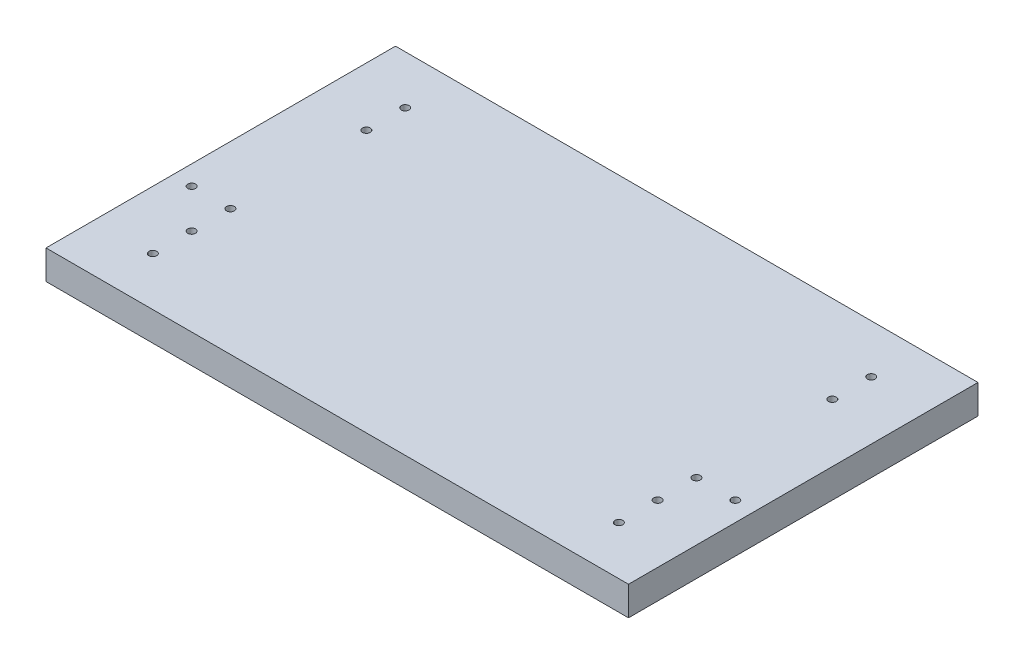
ISO-10303-21;
HEADER;
FILE_DESCRIPTION(('STEP AP214'),'2;1');
FILE_NAME('part.step','',(''),(''),'','','');
FILE_SCHEMA(('AUTOMOTIVE_DESIGN { 1 0 10303 214 1 1 1 1 }'));
ENDSEC;
DATA;
#1=APPLICATION_CONTEXT('core data for automotive mechanical design processes');
#2=APPLICATION_PROTOCOL_DEFINITION('international standard','automotive_design',2000,#1);
#3=PRODUCT_CONTEXT('',#1,'mechanical');
#4=PRODUCT('Part','Part','',(#3));
#5=PRODUCT_RELATED_PRODUCT_CATEGORY('part','',(#4));
#6=PRODUCT_DEFINITION_FORMATION('','',#4);
#7=PRODUCT_DEFINITION_CONTEXT('part definition',#1,'design');
#8=PRODUCT_DEFINITION('design','',#6,#7);
#9=PRODUCT_DEFINITION_SHAPE('','',#8);
#10=(LENGTH_UNIT() NAMED_UNIT(*) SI_UNIT(.MILLI.,.METRE.));
#11=(NAMED_UNIT(*) PLANE_ANGLE_UNIT() SI_UNIT($,.RADIAN.));
#12=(NAMED_UNIT(*) SI_UNIT($,.STERADIAN.) SOLID_ANGLE_UNIT());
#13=UNCERTAINTY_MEASURE_WITH_UNIT(LENGTH_MEASURE(1.E-05),#10,'distance_accuracy_value','');
#14=(GEOMETRIC_REPRESENTATION_CONTEXT(3) GLOBAL_UNCERTAINTY_ASSIGNED_CONTEXT((#13)) GLOBAL_UNIT_ASSIGNED_CONTEXT((#10,
#11,#12)) REPRESENTATION_CONTEXT('',''));
#15=CARTESIAN_POINT('',(0.,0.,0.));
#16=DIRECTION('',(0.,0.,1.));
#17=DIRECTION('',(1.,0.,0.));
#18=AXIS2_PLACEMENT_3D('',#15,#16,#17);
#19=CARTESIAN_POINT('',(150.,15.,90.));
#20=DIRECTION('',(-1.,0.,0.));
#21=DIRECTION('',(0.,0.,1.));
#22=AXIS2_PLACEMENT_3D('',#19,#20,#21);
#23=PLANE('',#22);
#24=DIRECTION('',(0.,0.,-1.));
#25=VECTOR('',#24,1.);
#26=CARTESIAN_POINT('',(150.,0.,90.));
#27=LINE('',#26,#25);
#28=CARTESIAN_POINT('',(150.,0.,90.));
#29=VERTEX_POINT('',#28);
#30=CARTESIAN_POINT('',(150.,0.,-90.));
#31=VERTEX_POINT('',#30);
#32=EDGE_CURVE('E96',#29,#31,#27,.T.);
#33=ORIENTED_EDGE('',*,*,#32,.T.);
#34=DIRECTION('',(0.,-1.,0.));
#35=VECTOR('',#34,1.);
#36=CARTESIAN_POINT('',(150.,15.,-90.));
#37=LINE('',#36,#35);
#38=CARTESIAN_POINT('',(150.,15.,-90.));
#39=VERTEX_POINT('',#38);
#40=EDGE_CURVE('E11',#39,#31,#37,.T.);
#41=ORIENTED_EDGE('',*,*,#40,.F.);
#42=DIRECTION('',(0.,0.,-1.));
#43=VECTOR('',#42,1.);
#44=CARTESIAN_POINT('',(150.,15.,90.));
#45=LINE('',#44,#43);
#46=CARTESIAN_POINT('',(150.,15.,90.));
#47=VERTEX_POINT('',#46);
#48=EDGE_CURVE('E84',#47,#39,#45,.T.);
#49=ORIENTED_EDGE('',*,*,#48,.F.);
#50=DIRECTION('',(0.,-1.,0.));
#51=VECTOR('',#50,1.);
#52=CARTESIAN_POINT('',(150.,15.,90.));
#53=LINE('',#52,#51);
#54=EDGE_CURVE('E92',#47,#29,#53,.T.);
#55=ORIENTED_EDGE('',*,*,#54,.T.);
#56=EDGE_LOOP('',(#33,#41,#49,#55));
#57=FACE_BOUND('',#56,.T.);
#58=ADVANCED_FACE('F33',(#57),#23,.F.);
#59=CARTESIAN_POINT('',(-150.,15.,-90.));
#60=DIRECTION('',(0.,0.,1.));
#61=DIRECTION('',(1.,0.,0.));
#62=AXIS2_PLACEMENT_3D('',#59,#60,#61);
#63=PLANE('',#62);
#64=DIRECTION('',(-1.,0.,0.));
#65=VECTOR('',#64,1.);
#66=CARTESIAN_POINT('',(-150.,0.,-90.));
#67=LINE('',#66,#65);
#68=CARTESIAN_POINT('',(-150.,0.,-90.));
#69=VERTEX_POINT('',#68);
#70=EDGE_CURVE('E88',#31,#69,#67,.T.);
#71=ORIENTED_EDGE('',*,*,#70,.T.);
#72=DIRECTION('',(0.,-1.,0.));
#73=VECTOR('',#72,1.);
#74=CARTESIAN_POINT('',(-150.,15.,-90.));
#75=LINE('',#74,#73);
#76=CARTESIAN_POINT('',(-150.,15.,-90.));
#77=VERTEX_POINT('',#76);
#78=EDGE_CURVE('E41',#77,#69,#75,.T.);
#79=ORIENTED_EDGE('',*,*,#78,.F.);
#80=DIRECTION('',(-1.,0.,0.));
#81=VECTOR('',#80,1.);
#82=CARTESIAN_POINT('',(-150.,15.,-90.));
#83=LINE('',#82,#81);
#84=EDGE_CURVE('E79',#39,#77,#83,.T.);
#85=ORIENTED_EDGE('',*,*,#84,.F.);
#86=ORIENTED_EDGE('',*,*,#40,.T.);
#87=EDGE_LOOP('',(#71,#79,#85,#86));
#88=FACE_BOUND('',#87,.T.);
#89=ADVANCED_FACE('F87',(#88),#63,.F.);
#90=CARTESIAN_POINT('',(-150.,15.,90.));
#91=DIRECTION('',(1.,0.,0.));
#92=DIRECTION('',(0.,0.,-1.));
#93=AXIS2_PLACEMENT_3D('',#90,#91,#92);
#94=PLANE('',#93);
#95=DIRECTION('',(0.,0.,1.));
#96=VECTOR('',#95,1.);
#97=CARTESIAN_POINT('',(-150.,0.,90.));
#98=LINE('',#97,#96);
#99=CARTESIAN_POINT('',(-150.,0.,90.));
#100=VERTEX_POINT('',#99);
#101=EDGE_CURVE('E66',#69,#100,#98,.T.);
#102=ORIENTED_EDGE('',*,*,#101,.T.);
#103=DIRECTION('',(0.,-1.,0.));
#104=VECTOR('',#103,1.);
#105=CARTESIAN_POINT('',(-150.,15.,90.));
#106=LINE('',#105,#104);
#107=CARTESIAN_POINT('',(-150.,15.,90.));
#108=VERTEX_POINT('',#107);
#109=EDGE_CURVE('E89',#108,#100,#106,.T.);
#110=ORIENTED_EDGE('',*,*,#109,.F.);
#111=DIRECTION('',(0.,0.,1.));
#112=VECTOR('',#111,1.);
#113=CARTESIAN_POINT('',(-150.,15.,90.));
#114=LINE('',#113,#112);
#115=EDGE_CURVE('E82',#77,#108,#114,.T.);
#116=ORIENTED_EDGE('',*,*,#115,.F.);
#117=ORIENTED_EDGE('',*,*,#78,.T.);
#118=EDGE_LOOP('',(#102,#110,#116,#117));
#119=FACE_BOUND('',#118,.T.);
#120=ADVANCED_FACE('F90',(#119),#94,.F.);
#121=CARTESIAN_POINT('',(-150.,15.,90.));
#122=DIRECTION('',(0.,0.,-1.));
#123=DIRECTION('',(-1.,0.,0.));
#124=AXIS2_PLACEMENT_3D('',#121,#122,#123);
#125=PLANE('',#124);
#126=DIRECTION('',(1.,0.,0.));
#127=VECTOR('',#126,1.);
#128=CARTESIAN_POINT('',(-150.,0.,90.));
#129=LINE('',#128,#127);
#130=EDGE_CURVE('E72',#100,#29,#129,.T.);
#131=ORIENTED_EDGE('',*,*,#130,.T.);
#132=ORIENTED_EDGE('',*,*,#54,.F.);
#133=DIRECTION('',(1.,0.,0.));
#134=VECTOR('',#133,1.);
#135=CARTESIAN_POINT('',(-150.,15.,90.));
#136=LINE('',#135,#134);
#137=EDGE_CURVE('E49',#108,#47,#136,.T.);
#138=ORIENTED_EDGE('',*,*,#137,.F.);
#139=ORIENTED_EDGE('',*,*,#109,.T.);
#140=EDGE_LOOP('',(#131,#132,#138,#139));
#141=FACE_BOUND('',#140,.T.);
#142=ADVANCED_FACE('F104',(#141),#125,.F.);
#143=CARTESIAN_POINT('',(0.,15.,0.));
#144=DIRECTION('',(0.,-1.,0.));
#145=DIRECTION('',(0.,0.,-1.));
#146=AXIS2_PLACEMENT_3D('',#143,#144,#145);
#147=PLANE('',#146);
#148=CARTESIAN_POINT('',(120.,15.,-65.));
#149=DIRECTION('',(0.,1.,0.));
#150=DIRECTION('',(0.,0.,1.));
#151=AXIS2_PLACEMENT_3D('',#148,#149,#150);
#152=CIRCLE('',#151,2.);
#153=CARTESIAN_POINT('',(120.,15.,-63.));
#154=VERTEX_POINT('',#153);
#155=EDGE_CURVE('E176',#154,#154,#152,.T.);
#156=ORIENTED_EDGE('',*,*,#155,.F.);
#157=EDGE_LOOP('',(#156));
#158=FACE_BOUND('',#157,.T.);
#159=CARTESIAN_POINT('',(140.,15.,25.));
#160=DIRECTION('',(0.,1.,0.));
#161=DIRECTION('',(0.,0.,1.));
#162=AXIS2_PLACEMENT_3D('',#159,#160,#161);
#163=CIRCLE('',#162,2.);
#164=CARTESIAN_POINT('',(140.,15.,27.));
#165=VERTEX_POINT('',#164);
#166=EDGE_CURVE('E170',#165,#165,#163,.T.);
#167=ORIENTED_EDGE('',*,*,#166,.F.);
#168=EDGE_LOOP('',(#167));
#169=FACE_BOUND('',#168,.T.);
#170=CARTESIAN_POINT('',(120.,15.,25.));
#171=DIRECTION('',(0.,1.,0.));
#172=DIRECTION('',(0.,0.,1.));
#173=AXIS2_PLACEMENT_3D('',#170,#171,#172);
#174=CIRCLE('',#173,2.);
#175=CARTESIAN_POINT('',(120.,15.,27.));
#176=VERTEX_POINT('',#175);
#177=EDGE_CURVE('E164',#176,#176,#174,.T.);
#178=ORIENTED_EDGE('',*,*,#177,.F.);
#179=EDGE_LOOP('',(#178));
#180=FACE_BOUND('',#179,.T.);
#181=CARTESIAN_POINT('',(-120.,15.,25.));
#182=DIRECTION('',(0.,1.,0.));
#183=DIRECTION('',(0.,0.,1.));
#184=AXIS2_PLACEMENT_3D('',#181,#182,#183);
#185=CIRCLE('',#184,2.);
#186=CARTESIAN_POINT('',(-120.,15.,27.));
#187=VERTEX_POINT('',#186);
#188=EDGE_CURVE('E158',#187,#187,#185,.T.);
#189=ORIENTED_EDGE('',*,*,#188,.F.);
#190=EDGE_LOOP('',(#189));
#191=FACE_BOUND('',#190,.T.);
#192=CARTESIAN_POINT('',(-140.,15.,25.));
#193=DIRECTION('',(0.,1.,0.));
#194=DIRECTION('',(0.,0.,1.));
#195=AXIS2_PLACEMENT_3D('',#192,#193,#194);
#196=CIRCLE('',#195,2.);
#197=CARTESIAN_POINT('',(-140.,15.,27.));
#198=VERTEX_POINT('',#197);
#199=EDGE_CURVE('E152',#198,#198,#196,.T.);
#200=ORIENTED_EDGE('',*,*,#199,.F.);
#201=EDGE_LOOP('',(#200));
#202=FACE_BOUND('',#201,.T.);
#203=CARTESIAN_POINT('',(120.,15.,-45.));
#204=DIRECTION('',(0.,1.,0.));
#205=DIRECTION('',(0.,0.,1.));
#206=AXIS2_PLACEMENT_3D('',#203,#204,#205);
#207=CIRCLE('',#206,2.);
#208=CARTESIAN_POINT('',(120.,15.,-43.));
#209=VERTEX_POINT('',#208);
#210=EDGE_CURVE('E146',#209,#209,#207,.T.);
#211=ORIENTED_EDGE('',*,*,#210,.F.);
#212=EDGE_LOOP('',(#211));
#213=FACE_BOUND('',#212,.T.);
#214=CARTESIAN_POINT('',(-120.,15.,-45.));
#215=DIRECTION('',(0.,1.,0.));
#216=DIRECTION('',(0.,0.,1.));
#217=AXIS2_PLACEMENT_3D('',#214,#215,#216);
#218=CIRCLE('',#217,2.00000000000001);
#219=CARTESIAN_POINT('',(-120.,15.,-43.));
#220=VERTEX_POINT('',#219);
#221=EDGE_CURVE('E140',#220,#220,#218,.T.);
#222=ORIENTED_EDGE('',*,*,#221,.F.);
#223=EDGE_LOOP('',(#222));
#224=FACE_BOUND('',#223,.T.);
#225=CARTESIAN_POINT('',(-120.,15.,-65.));
#226=DIRECTION('',(0.,1.,0.));
#227=DIRECTION('',(0.,0.,1.));
#228=AXIS2_PLACEMENT_3D('',#225,#226,#227);
#229=CIRCLE('',#228,2.);
#230=CARTESIAN_POINT('',(-120.,15.,-63.));
#231=VERTEX_POINT('',#230);
#232=EDGE_CURVE('E134',#231,#231,#229,.T.);
#233=ORIENTED_EDGE('',*,*,#232,.F.);
#234=EDGE_LOOP('',(#233));
#235=FACE_BOUND('',#234,.T.);
#236=CARTESIAN_POINT('',(120.,15.,45.));
#237=DIRECTION('',(0.,1.,0.));
#238=DIRECTION('',(0.,0.,1.));
#239=AXIS2_PLACEMENT_3D('',#236,#237,#238);
#240=CIRCLE('',#239,2.);
#241=CARTESIAN_POINT('',(120.,15.,47.));
#242=VERTEX_POINT('',#241);
#243=EDGE_CURVE('E128',#242,#242,#240,.T.);
#244=ORIENTED_EDGE('',*,*,#243,.F.);
#245=EDGE_LOOP('',(#244));
#246=FACE_BOUND('',#245,.T.);
#247=CARTESIAN_POINT('',(120.,15.,65.));
#248=DIRECTION('',(0.,1.,0.));
#249=DIRECTION('',(0.,0.,1.));
#250=AXIS2_PLACEMENT_3D('',#247,#248,#249);
#251=CIRCLE('',#250,2.);
#252=CARTESIAN_POINT('',(120.,15.,67.));
#253=VERTEX_POINT('',#252);
#254=EDGE_CURVE('E122',#253,#253,#251,.T.);
#255=ORIENTED_EDGE('',*,*,#254,.F.);
#256=EDGE_LOOP('',(#255));
#257=FACE_BOUND('',#256,.T.);
#258=CARTESIAN_POINT('',(-120.,15.,45.));
#259=DIRECTION('',(0.,1.,0.));
#260=DIRECTION('',(0.,0.,1.));
#261=AXIS2_PLACEMENT_3D('',#258,#259,#260);
#262=CIRCLE('',#261,2.);
#263=CARTESIAN_POINT('',(-120.,15.,47.));
#264=VERTEX_POINT('',#263);
#265=EDGE_CURVE('E116',#264,#264,#262,.T.);
#266=ORIENTED_EDGE('',*,*,#265,.F.);
#267=EDGE_LOOP('',(#266));
#268=FACE_BOUND('',#267,.T.);
#269=CARTESIAN_POINT('',(-120.,15.,65.));
#270=DIRECTION('',(0.,1.,0.));
#271=DIRECTION('',(0.,0.,1.));
#272=AXIS2_PLACEMENT_3D('',#269,#270,#271);
#273=CIRCLE('',#272,2.);
#274=CARTESIAN_POINT('',(-120.,15.,67.));
#275=VERTEX_POINT('',#274);
#276=EDGE_CURVE('E110',#275,#275,#273,.T.);
#277=ORIENTED_EDGE('',*,*,#276,.F.);
#278=EDGE_LOOP('',(#277));
#279=FACE_BOUND('',#278,.T.);
#280=ORIENTED_EDGE('',*,*,#48,.T.);
#281=ORIENTED_EDGE('',*,*,#84,.T.);
#282=ORIENTED_EDGE('',*,*,#115,.T.);
#283=ORIENTED_EDGE('',*,*,#137,.T.);
#284=EDGE_LOOP('',(#280,#281,#282,#283));
#285=FACE_BOUND('',#284,.T.);
#286=ADVANCED_FACE('F80',(#158,#169,#180,#191,#202,#213,#224,#235,#246,#257,#268,#279,#285),
#147,.F.);
#287=CARTESIAN_POINT('',(0.,0.,0.));
#288=DIRECTION('',(0.,-1.,0.));
#289=DIRECTION('',(0.,0.,-1.));
#290=AXIS2_PLACEMENT_3D('',#287,#288,#289);
#291=PLANE('',#290);
#292=ORIENTED_EDGE('',*,*,#32,.F.);
#293=ORIENTED_EDGE('',*,*,#130,.F.);
#294=ORIENTED_EDGE('',*,*,#101,.F.);
#295=ORIENTED_EDGE('',*,*,#70,.F.);
#296=EDGE_LOOP('',(#292,#293,#294,#295));
#297=FACE_BOUND('',#296,.T.);
#298=ADVANCED_FACE('F107',(#297),#291,.T.);
#299=CARTESIAN_POINT('',(-120.,5.,65.));
#300=DIRECTION('',(0.,1.,0.));
#301=DIRECTION('',(0.,0.,1.));
#302=AXIS2_PLACEMENT_3D('',#299,#300,#301);
#303=CYLINDRICAL_SURFACE('',#302,2.);
#304=CARTESIAN_POINT('',(-120.,5.,65.));
#305=DIRECTION('',(0.,1.,0.));
#306=DIRECTION('',(0.,0.,1.));
#307=AXIS2_PLACEMENT_3D('',#304,#305,#306);
#308=CIRCLE('',#307,2.);
#309=CARTESIAN_POINT('',(-120.,5.,67.));
#310=VERTEX_POINT('',#309);
#311=EDGE_CURVE('E99',#310,#310,#308,.T.);
#312=ORIENTED_EDGE('',*,*,#311,.F.);
#313=EDGE_LOOP('',(#312));
#314=FACE_BOUND('',#313,.T.);
#315=ORIENTED_EDGE('',*,*,#276,.T.);
#316=EDGE_LOOP('',(#315));
#317=FACE_BOUND('',#316,.T.);
#318=ADVANCED_FACE('F216',(#314,#317),#303,.F.);
#319=CARTESIAN_POINT('',(-120.,5.,65.));
#320=DIRECTION('',(0.,1.,0.));
#321=DIRECTION('',(0.,0.,1.));
#322=AXIS2_PLACEMENT_3D('',#319,#320,#321);
#323=PLANE('',#322);
#324=ORIENTED_EDGE('',*,*,#311,.T.);
#325=EDGE_LOOP('',(#324));
#326=FACE_BOUND('',#325,.T.);
#327=ADVANCED_FACE('F218',(#326),#323,.T.);
#328=CARTESIAN_POINT('',(-120.,5.,45.));
#329=DIRECTION('',(0.,1.,0.));
#330=DIRECTION('',(0.,0.,1.));
#331=AXIS2_PLACEMENT_3D('',#328,#329,#330);
#332=CYLINDRICAL_SURFACE('',#331,2.);
#333=CARTESIAN_POINT('',(-120.,5.,45.));
#334=DIRECTION('',(0.,1.,0.));
#335=DIRECTION('',(0.,0.,1.));
#336=AXIS2_PLACEMENT_3D('',#333,#334,#335);
#337=CIRCLE('',#336,2.);
#338=CARTESIAN_POINT('',(-120.,5.,47.));
#339=VERTEX_POINT('',#338);
#340=EDGE_CURVE('E113',#339,#339,#337,.T.);
#341=ORIENTED_EDGE('',*,*,#340,.F.);
#342=EDGE_LOOP('',(#341));
#343=FACE_BOUND('',#342,.T.);
#344=ORIENTED_EDGE('',*,*,#265,.T.);
#345=EDGE_LOOP('',(#344));
#346=FACE_BOUND('',#345,.T.);
#347=ADVANCED_FACE('F225',(#343,#346),#332,.F.);
#348=CARTESIAN_POINT('',(-120.,5.,45.));
#349=DIRECTION('',(0.,1.,0.));
#350=DIRECTION('',(0.,0.,1.));
#351=AXIS2_PLACEMENT_3D('',#348,#349,#350);
#352=PLANE('',#351);
#353=ORIENTED_EDGE('',*,*,#340,.T.);
#354=EDGE_LOOP('',(#353));
#355=FACE_BOUND('',#354,.T.);
#356=ADVANCED_FACE('F273',(#355),#352,.T.);
#357=CARTESIAN_POINT('',(120.,5.,65.));
#358=DIRECTION('',(0.,1.,0.));
#359=DIRECTION('',(0.,0.,1.));
#360=AXIS2_PLACEMENT_3D('',#357,#358,#359);
#361=CYLINDRICAL_SURFACE('',#360,2.);
#362=CARTESIAN_POINT('',(120.,5.,65.));
#363=DIRECTION('',(0.,1.,0.));
#364=DIRECTION('',(0.,0.,1.));
#365=AXIS2_PLACEMENT_3D('',#362,#363,#364);
#366=CIRCLE('',#365,2.);
#367=CARTESIAN_POINT('',(120.,5.,67.));
#368=VERTEX_POINT('',#367);
#369=EDGE_CURVE('E119',#368,#368,#366,.T.);
#370=ORIENTED_EDGE('',*,*,#369,.F.);
#371=EDGE_LOOP('',(#370));
#372=FACE_BOUND('',#371,.T.);
#373=ORIENTED_EDGE('',*,*,#254,.T.);
#374=EDGE_LOOP('',(#373));
#375=FACE_BOUND('',#374,.T.);
#376=ADVANCED_FACE('F282',(#372,#375),#361,.F.);
#377=CARTESIAN_POINT('',(120.,5.,65.));
#378=DIRECTION('',(0.,1.,0.));
#379=DIRECTION('',(0.,0.,1.));
#380=AXIS2_PLACEMENT_3D('',#377,#378,#379);
#381=PLANE('',#380);
#382=ORIENTED_EDGE('',*,*,#369,.T.);
#383=EDGE_LOOP('',(#382));
#384=FACE_BOUND('',#383,.T.);
#385=ADVANCED_FACE('F291',(#384),#381,.T.);
#386=CARTESIAN_POINT('',(120.,5.,45.));
#387=DIRECTION('',(0.,1.,0.));
#388=DIRECTION('',(0.,0.,1.));
#389=AXIS2_PLACEMENT_3D('',#386,#387,#388);
#390=CYLINDRICAL_SURFACE('',#389,2.);
#391=CARTESIAN_POINT('',(120.,5.,45.));
#392=DIRECTION('',(0.,1.,0.));
#393=DIRECTION('',(0.,0.,1.));
#394=AXIS2_PLACEMENT_3D('',#391,#392,#393);
#395=CIRCLE('',#394,2.);
#396=CARTESIAN_POINT('',(120.,5.,47.));
#397=VERTEX_POINT('',#396);
#398=EDGE_CURVE('E125',#397,#397,#395,.T.);
#399=ORIENTED_EDGE('',*,*,#398,.F.);
#400=EDGE_LOOP('',(#399));
#401=FACE_BOUND('',#400,.T.);
#402=ORIENTED_EDGE('',*,*,#243,.T.);
#403=EDGE_LOOP('',(#402));
#404=FACE_BOUND('',#403,.T.);
#405=ADVANCED_FACE('F300',(#401,#404),#390,.F.);
#406=CARTESIAN_POINT('',(120.,5.,45.));
#407=DIRECTION('',(0.,1.,0.));
#408=DIRECTION('',(0.,0.,1.));
#409=AXIS2_PLACEMENT_3D('',#406,#407,#408);
#410=PLANE('',#409);
#411=ORIENTED_EDGE('',*,*,#398,.T.);
#412=EDGE_LOOP('',(#411));
#413=FACE_BOUND('',#412,.T.);
#414=ADVANCED_FACE('F309',(#413),#410,.T.);
#415=CARTESIAN_POINT('',(-120.,5.,-65.));
#416=DIRECTION('',(0.,1.,0.));
#417=DIRECTION('',(0.,0.,1.));
#418=AXIS2_PLACEMENT_3D('',#415,#416,#417);
#419=CYLINDRICAL_SURFACE('',#418,2.);
#420=CARTESIAN_POINT('',(-120.,5.,-65.));
#421=DIRECTION('',(0.,1.,0.));
#422=DIRECTION('',(0.,0.,1.));
#423=AXIS2_PLACEMENT_3D('',#420,#421,#422);
#424=CIRCLE('',#423,2.);
#425=CARTESIAN_POINT('',(-120.,5.,-63.));
#426=VERTEX_POINT('',#425);
#427=EDGE_CURVE('E131',#426,#426,#424,.T.);
#428=ORIENTED_EDGE('',*,*,#427,.F.);
#429=EDGE_LOOP('',(#428));
#430=FACE_BOUND('',#429,.T.);
#431=ORIENTED_EDGE('',*,*,#232,.T.);
#432=EDGE_LOOP('',(#431));
#433=FACE_BOUND('',#432,.T.);
#434=ADVANCED_FACE('F318',(#430,#433),#419,.F.);
#435=CARTESIAN_POINT('',(-120.,5.,-65.));
#436=DIRECTION('',(0.,1.,0.));
#437=DIRECTION('',(0.,0.,1.));
#438=AXIS2_PLACEMENT_3D('',#435,#436,#437);
#439=PLANE('',#438);
#440=ORIENTED_EDGE('',*,*,#427,.T.);
#441=EDGE_LOOP('',(#440));
#442=FACE_BOUND('',#441,.T.);
#443=ADVANCED_FACE('F327',(#442),#439,.T.);
#444=CARTESIAN_POINT('',(-120.,5.,-45.));
#445=DIRECTION('',(0.,1.,0.));
#446=DIRECTION('',(0.,0.,1.));
#447=AXIS2_PLACEMENT_3D('',#444,#445,#446);
#448=CYLINDRICAL_SURFACE('',#447,2.00000000000001);
#449=CARTESIAN_POINT('',(-120.,5.,-45.));
#450=DIRECTION('',(0.,1.,0.));
#451=DIRECTION('',(0.,0.,1.));
#452=AXIS2_PLACEMENT_3D('',#449,#450,#451);
#453=CIRCLE('',#452,2.00000000000001);
#454=CARTESIAN_POINT('',(-120.,5.,-43.));
#455=VERTEX_POINT('',#454);
#456=EDGE_CURVE('E137',#455,#455,#453,.T.);
#457=ORIENTED_EDGE('',*,*,#456,.F.);
#458=EDGE_LOOP('',(#457));
#459=FACE_BOUND('',#458,.T.);
#460=ORIENTED_EDGE('',*,*,#221,.T.);
#461=EDGE_LOOP('',(#460));
#462=FACE_BOUND('',#461,.T.);
#463=ADVANCED_FACE('F336',(#459,#462),#448,.F.);
#464=CARTESIAN_POINT('',(-120.,5.,-45.));
#465=DIRECTION('',(0.,1.,0.));
#466=DIRECTION('',(0.,0.,1.));
#467=AXIS2_PLACEMENT_3D('',#464,#465,#466);
#468=PLANE('',#467);
#469=ORIENTED_EDGE('',*,*,#456,.T.);
#470=EDGE_LOOP('',(#469));
#471=FACE_BOUND('',#470,.T.);
#472=ADVANCED_FACE('F345',(#471),#468,.T.);
#473=CARTESIAN_POINT('',(120.,5.,-45.));
#474=DIRECTION('',(0.,1.,0.));
#475=DIRECTION('',(0.,0.,1.));
#476=AXIS2_PLACEMENT_3D('',#473,#474,#475);
#477=CYLINDRICAL_SURFACE('',#476,2.);
#478=CARTESIAN_POINT('',(120.,5.,-45.));
#479=DIRECTION('',(0.,1.,0.));
#480=DIRECTION('',(0.,0.,1.));
#481=AXIS2_PLACEMENT_3D('',#478,#479,#480);
#482=CIRCLE('',#481,2.);
#483=CARTESIAN_POINT('',(120.,5.,-43.));
#484=VERTEX_POINT('',#483);
#485=EDGE_CURVE('E143',#484,#484,#482,.T.);
#486=ORIENTED_EDGE('',*,*,#485,.F.);
#487=EDGE_LOOP('',(#486));
#488=FACE_BOUND('',#487,.T.);
#489=ORIENTED_EDGE('',*,*,#210,.T.);
#490=EDGE_LOOP('',(#489));
#491=FACE_BOUND('',#490,.T.);
#492=ADVANCED_FACE('F354',(#488,#491),#477,.F.);
#493=CARTESIAN_POINT('',(120.,5.,-45.));
#494=DIRECTION('',(0.,1.,0.));
#495=DIRECTION('',(0.,0.,1.));
#496=AXIS2_PLACEMENT_3D('',#493,#494,#495);
#497=PLANE('',#496);
#498=ORIENTED_EDGE('',*,*,#485,.T.);
#499=EDGE_LOOP('',(#498));
#500=FACE_BOUND('',#499,.T.);
#501=ADVANCED_FACE('F363',(#500),#497,.T.);
#502=CARTESIAN_POINT('',(-140.,5.,25.));
#503=DIRECTION('',(0.,1.,0.));
#504=DIRECTION('',(0.,0.,1.));
#505=AXIS2_PLACEMENT_3D('',#502,#503,#504);
#506=CYLINDRICAL_SURFACE('',#505,2.);
#507=CARTESIAN_POINT('',(-140.,5.,25.));
#508=DIRECTION('',(0.,1.,0.));
#509=DIRECTION('',(0.,0.,1.));
#510=AXIS2_PLACEMENT_3D('',#507,#508,#509);
#511=CIRCLE('',#510,2.);
#512=CARTESIAN_POINT('',(-140.,5.,27.));
#513=VERTEX_POINT('',#512);
#514=EDGE_CURVE('E149',#513,#513,#511,.T.);
#515=ORIENTED_EDGE('',*,*,#514,.F.);
#516=EDGE_LOOP('',(#515));
#517=FACE_BOUND('',#516,.T.);
#518=ORIENTED_EDGE('',*,*,#199,.T.);
#519=EDGE_LOOP('',(#518));
#520=FACE_BOUND('',#519,.T.);
#521=ADVANCED_FACE('F372',(#517,#520),#506,.F.);
#522=CARTESIAN_POINT('',(-140.,5.,25.));
#523=DIRECTION('',(0.,1.,0.));
#524=DIRECTION('',(0.,0.,1.));
#525=AXIS2_PLACEMENT_3D('',#522,#523,#524);
#526=PLANE('',#525);
#527=ORIENTED_EDGE('',*,*,#514,.T.);
#528=EDGE_LOOP('',(#527));
#529=FACE_BOUND('',#528,.T.);
#530=ADVANCED_FACE('F381',(#529),#526,.T.);
#531=CARTESIAN_POINT('',(-120.,5.,25.));
#532=DIRECTION('',(0.,1.,0.));
#533=DIRECTION('',(0.,0.,1.));
#534=AXIS2_PLACEMENT_3D('',#531,#532,#533);
#535=CYLINDRICAL_SURFACE('',#534,2.);
#536=CARTESIAN_POINT('',(-120.,5.,25.));
#537=DIRECTION('',(0.,1.,0.));
#538=DIRECTION('',(0.,0.,1.));
#539=AXIS2_PLACEMENT_3D('',#536,#537,#538);
#540=CIRCLE('',#539,2.);
#541=CARTESIAN_POINT('',(-120.,5.,27.));
#542=VERTEX_POINT('',#541);
#543=EDGE_CURVE('E155',#542,#542,#540,.T.);
#544=ORIENTED_EDGE('',*,*,#543,.F.);
#545=EDGE_LOOP('',(#544));
#546=FACE_BOUND('',#545,.T.);
#547=ORIENTED_EDGE('',*,*,#188,.T.);
#548=EDGE_LOOP('',(#547));
#549=FACE_BOUND('',#548,.T.);
#550=ADVANCED_FACE('F390',(#546,#549),#535,.F.);
#551=CARTESIAN_POINT('',(-120.,5.,25.));
#552=DIRECTION('',(0.,1.,0.));
#553=DIRECTION('',(0.,0.,1.));
#554=AXIS2_PLACEMENT_3D('',#551,#552,#553);
#555=PLANE('',#554);
#556=ORIENTED_EDGE('',*,*,#543,.T.);
#557=EDGE_LOOP('',(#556));
#558=FACE_BOUND('',#557,.T.);
#559=ADVANCED_FACE('F399',(#558),#555,.T.);
#560=CARTESIAN_POINT('',(120.,5.,25.));
#561=DIRECTION('',(0.,1.,0.));
#562=DIRECTION('',(0.,0.,1.));
#563=AXIS2_PLACEMENT_3D('',#560,#561,#562);
#564=CYLINDRICAL_SURFACE('',#563,2.);
#565=CARTESIAN_POINT('',(120.,5.,25.));
#566=DIRECTION('',(0.,1.,0.));
#567=DIRECTION('',(0.,0.,1.));
#568=AXIS2_PLACEMENT_3D('',#565,#566,#567);
#569=CIRCLE('',#568,2.);
#570=CARTESIAN_POINT('',(120.,5.,27.));
#571=VERTEX_POINT('',#570);
#572=EDGE_CURVE('E161',#571,#571,#569,.T.);
#573=ORIENTED_EDGE('',*,*,#572,.F.);
#574=EDGE_LOOP('',(#573));
#575=FACE_BOUND('',#574,.T.);
#576=ORIENTED_EDGE('',*,*,#177,.T.);
#577=EDGE_LOOP('',(#576));
#578=FACE_BOUND('',#577,.T.);
#579=ADVANCED_FACE('F408',(#575,#578),#564,.F.);
#580=CARTESIAN_POINT('',(120.,5.,25.));
#581=DIRECTION('',(0.,1.,0.));
#582=DIRECTION('',(0.,0.,1.));
#583=AXIS2_PLACEMENT_3D('',#580,#581,#582);
#584=PLANE('',#583);
#585=ORIENTED_EDGE('',*,*,#572,.T.);
#586=EDGE_LOOP('',(#585));
#587=FACE_BOUND('',#586,.T.);
#588=ADVANCED_FACE('F417',(#587),#584,.T.);
#589=CARTESIAN_POINT('',(140.,5.,25.));
#590=DIRECTION('',(0.,1.,0.));
#591=DIRECTION('',(0.,0.,1.));
#592=AXIS2_PLACEMENT_3D('',#589,#590,#591);
#593=CYLINDRICAL_SURFACE('',#592,2.);
#594=CARTESIAN_POINT('',(140.,5.,25.));
#595=DIRECTION('',(0.,1.,0.));
#596=DIRECTION('',(0.,0.,1.));
#597=AXIS2_PLACEMENT_3D('',#594,#595,#596);
#598=CIRCLE('',#597,2.);
#599=CARTESIAN_POINT('',(140.,5.,27.));
#600=VERTEX_POINT('',#599);
#601=EDGE_CURVE('E167',#600,#600,#598,.T.);
#602=ORIENTED_EDGE('',*,*,#601,.F.);
#603=EDGE_LOOP('',(#602));
#604=FACE_BOUND('',#603,.T.);
#605=ORIENTED_EDGE('',*,*,#166,.T.);
#606=EDGE_LOOP('',(#605));
#607=FACE_BOUND('',#606,.T.);
#608=ADVANCED_FACE('F426',(#604,#607),#593,.F.);
#609=CARTESIAN_POINT('',(140.,5.,25.));
#610=DIRECTION('',(0.,1.,0.));
#611=DIRECTION('',(0.,0.,1.));
#612=AXIS2_PLACEMENT_3D('',#609,#610,#611);
#613=PLANE('',#612);
#614=ORIENTED_EDGE('',*,*,#601,.T.);
#615=EDGE_LOOP('',(#614));
#616=FACE_BOUND('',#615,.T.);
#617=ADVANCED_FACE('F187',(#616),#613,.T.);
#618=CARTESIAN_POINT('',(120.,5.,-65.));
#619=DIRECTION('',(0.,1.,0.));
#620=DIRECTION('',(0.,0.,1.));
#621=AXIS2_PLACEMENT_3D('',#618,#619,#620);
#622=CYLINDRICAL_SURFACE('',#621,2.);
#623=CARTESIAN_POINT('',(120.,5.,-65.));
#624=DIRECTION('',(0.,1.,0.));
#625=DIRECTION('',(0.,0.,1.));
#626=AXIS2_PLACEMENT_3D('',#623,#624,#625);
#627=CIRCLE('',#626,2.);
#628=CARTESIAN_POINT('',(120.,5.,-63.));
#629=VERTEX_POINT('',#628);
#630=EDGE_CURVE('E173',#629,#629,#627,.T.);
#631=ORIENTED_EDGE('',*,*,#630,.F.);
#632=EDGE_LOOP('',(#631));
#633=FACE_BOUND('',#632,.T.);
#634=ORIENTED_EDGE('',*,*,#155,.T.);
#635=EDGE_LOOP('',(#634));
#636=FACE_BOUND('',#635,.T.);
#637=ADVANCED_FACE('F184',(#633,#636),#622,.F.);
#638=CARTESIAN_POINT('',(120.,5.,-65.));
#639=DIRECTION('',(0.,1.,0.));
#640=DIRECTION('',(0.,0.,1.));
#641=AXIS2_PLACEMENT_3D('',#638,#639,#640);
#642=PLANE('',#641);
#643=ORIENTED_EDGE('',*,*,#630,.T.);
#644=EDGE_LOOP('',(#643));
#645=FACE_BOUND('',#644,.T.);
#646=ADVANCED_FACE('F182',(#645),#642,.T.);
#647=CLOSED_SHELL('',(#58,#89,#120,#142,#286,#298,#318,#327,#347,#356,#376,#385,#405,#414,#434,
#443,#463,#472,#492,#501,#521,#530,#550,#559,#579,#588,#608,#617,#637,#646));
#648=MANIFOLD_SOLID_BREP('B2',#647);
#649=ADVANCED_BREP_SHAPE_REPRESENTATION('',(#18,#648),#14);
#650=SHAPE_DEFINITION_REPRESENTATION(#9,#649);
ENDSEC;
END-ISO-10303-21;
